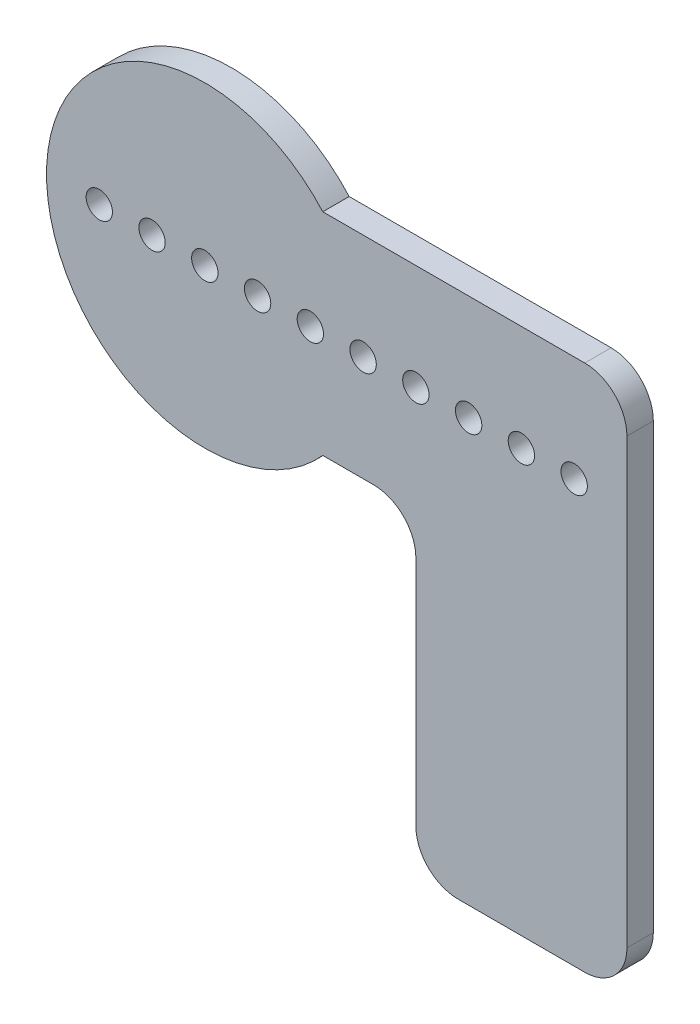
ISO-10303-21;
HEADER;
FILE_DESCRIPTION(('STEP AP214'),'2;1');
FILE_NAME('part.step','',(''),(''),'','','');
FILE_SCHEMA(('AUTOMOTIVE_DESIGN { 1 0 10303 214 1 1 1 1 }'));
ENDSEC;
DATA;
#1=APPLICATION_CONTEXT('core data for automotive mechanical design processes');
#2=APPLICATION_PROTOCOL_DEFINITION('international standard','automotive_design',2000,#1);
#3=PRODUCT_CONTEXT('',#1,'mechanical');
#4=PRODUCT('Part','Part','',(#3));
#5=PRODUCT_RELATED_PRODUCT_CATEGORY('part','',(#4));
#6=PRODUCT_DEFINITION_FORMATION('','',#4);
#7=PRODUCT_DEFINITION_CONTEXT('part definition',#1,'design');
#8=PRODUCT_DEFINITION('design','',#6,#7);
#9=PRODUCT_DEFINITION_SHAPE('','',#8);
#10=(LENGTH_UNIT() NAMED_UNIT(*) SI_UNIT(.MILLI.,.METRE.));
#11=(NAMED_UNIT(*) PLANE_ANGLE_UNIT() SI_UNIT($,.RADIAN.));
#12=(NAMED_UNIT(*) SI_UNIT($,.STERADIAN.) SOLID_ANGLE_UNIT());
#13=UNCERTAINTY_MEASURE_WITH_UNIT(LENGTH_MEASURE(1.E-05),#10,'distance_accuracy_value','');
#14=(GEOMETRIC_REPRESENTATION_CONTEXT(3) GLOBAL_UNCERTAINTY_ASSIGNED_CONTEXT((#13)) GLOBAL_UNIT_ASSIGNED_CONTEXT((#10,
#11,#12)) REPRESENTATION_CONTEXT('',''));
#15=CARTESIAN_POINT('',(0.,0.,0.));
#16=DIRECTION('',(0.,0.,1.));
#17=DIRECTION('',(1.,0.,0.));
#18=AXIS2_PLACEMENT_3D('',#15,#16,#17);
#19=CARTESIAN_POINT('',(-50.8,50.8,3.175));
#20=DIRECTION('',(0.,0.,-1.));
#21=DIRECTION('',(-1.,0.,0.));
#22=AXIS2_PLACEMENT_3D('',#19,#20,#21);
#23=CYLINDRICAL_SURFACE('',#22,19.05);
#24=CARTESIAN_POINT('',(-50.8,50.8,0.));
#25=DIRECTION('',(0.,0.,1.));
#26=DIRECTION('',(1.,0.,0.));
#27=AXIS2_PLACEMENT_3D('',#24,#25,#26);
#28=CIRCLE('',#27,19.05);
#29=CARTESIAN_POINT('',(-36.6009683428763,63.5,0.));
#30=VERTEX_POINT('',#29);
#31=CARTESIAN_POINT('',(-36.6009683428763,38.1,0.));
#32=VERTEX_POINT('',#31);
#33=EDGE_CURVE('E133',#30,#32,#28,.T.);
#34=ORIENTED_EDGE('',*,*,#33,.T.);
#35=DIRECTION('',(0.,0.,-1.));
#36=VECTOR('',#35,1.);
#37=CARTESIAN_POINT('',(-36.6009683428763,38.1,3.175));
#38=LINE('',#37,#36);
#39=CARTESIAN_POINT('',(-36.6009683428763,38.1,3.175));
#40=VERTEX_POINT('',#39);
#41=EDGE_CURVE('E116',#40,#32,#38,.T.);
#42=ORIENTED_EDGE('',*,*,#41,.F.);
#43=CARTESIAN_POINT('',(-50.8,50.8,3.175));
#44=DIRECTION('',(0.,0.,1.));
#45=DIRECTION('',(1.,0.,0.));
#46=AXIS2_PLACEMENT_3D('',#43,#44,#45);
#47=CIRCLE('',#46,19.05);
#48=CARTESIAN_POINT('',(-36.6009683428763,63.5,3.175));
#49=VERTEX_POINT('',#48);
#50=EDGE_CURVE('E121',#49,#40,#47,.T.);
#51=ORIENTED_EDGE('',*,*,#50,.F.);
#52=DIRECTION('',(0.,0.,-1.));
#53=VECTOR('',#52,1.);
#54=CARTESIAN_POINT('',(-36.6009683428763,63.5,3.175));
#55=LINE('',#54,#53);
#56=EDGE_CURVE('E135',#49,#30,#55,.T.);
#57=ORIENTED_EDGE('',*,*,#56,.T.);
#58=EDGE_LOOP('',(#34,#42,#51,#57));
#59=FACE_BOUND('',#58,.T.);
#60=ADVANCED_FACE('F35',(#59),#23,.T.);
#61=CARTESIAN_POINT('',(0.,38.1,3.175));
#62=DIRECTION('',(0.,-1.,0.));
#63=DIRECTION('',(1.,0.,0.));
#64=AXIS2_PLACEMENT_3D('',#61,#62,#63);
#65=PLANE('',#64);
#66=DIRECTION('',(-1.,0.,0.));
#67=VECTOR('',#66,1.);
#68=CARTESIAN_POINT('',(0.,38.1,0.));
#69=LINE('',#68,#67);
#70=CARTESIAN_POINT('',(-30.48,38.1,0.));
#71=VERTEX_POINT('',#70);
#72=EDGE_CURVE('E172',#71,#32,#69,.T.);
#73=ORIENTED_EDGE('',*,*,#72,.F.);
#74=DIRECTION('',(0.,0.,-1.));
#75=VECTOR('',#74,1.);
#76=CARTESIAN_POINT('',(-30.48,38.1,3.175));
#77=LINE('',#76,#75);
#78=CARTESIAN_POINT('',(-30.48,38.1,3.175));
#79=VERTEX_POINT('',#78);
#80=EDGE_CURVE('E119',#71,#79,#77,.F.);
#81=ORIENTED_EDGE('',*,*,#80,.T.);
#82=DIRECTION('',(-1.,0.,0.));
#83=VECTOR('',#82,1.);
#84=CARTESIAN_POINT('',(0.,38.1,3.175));
#85=LINE('',#84,#83);
#86=EDGE_CURVE('E111',#79,#40,#85,.T.);
#87=ORIENTED_EDGE('',*,*,#86,.T.);
#88=ORIENTED_EDGE('',*,*,#41,.T.);
#89=EDGE_LOOP('',(#73,#81,#87,#88));
#90=FACE_BOUND('',#89,.T.);
#91=ADVANCED_FACE('F114',(#90),#65,.T.);
#92=CARTESIAN_POINT('',(-25.4,0.,3.175));
#93=DIRECTION('',(-1.,0.,0.));
#94=DIRECTION('',(0.,0.,1.));
#95=AXIS2_PLACEMENT_3D('',#92,#93,#94);
#96=PLANE('',#95);
#97=DIRECTION('',(0.,1.,0.));
#98=VECTOR('',#97,1.);
#99=CARTESIAN_POINT('',(-25.4,0.,0.));
#100=LINE('',#99,#98);
#101=CARTESIAN_POINT('',(-25.4,5.08,0.));
#102=VERTEX_POINT('',#101);
#103=CARTESIAN_POINT('',(-25.4,33.02,0.));
#104=VERTEX_POINT('',#103);
#105=EDGE_CURVE('E174',#102,#104,#100,.T.);
#106=ORIENTED_EDGE('',*,*,#105,.F.);
#107=DIRECTION('',(0.,0.,-1.));
#108=VECTOR('',#107,1.);
#109=CARTESIAN_POINT('',(-25.4,5.08,3.175));
#110=LINE('',#109,#108);
#111=CARTESIAN_POINT('',(-25.4,5.08,3.175));
#112=VERTEX_POINT('',#111);
#113=EDGE_CURVE('E163',#102,#112,#110,.F.);
#114=ORIENTED_EDGE('',*,*,#113,.T.);
#115=DIRECTION('',(0.,1.,0.));
#116=VECTOR('',#115,1.);
#117=CARTESIAN_POINT('',(-25.4,0.,3.175));
#118=LINE('',#117,#116);
#119=CARTESIAN_POINT('',(-25.4,33.02,3.175));
#120=VERTEX_POINT('',#119);
#121=EDGE_CURVE('E120',#112,#120,#118,.T.);
#122=ORIENTED_EDGE('',*,*,#121,.T.);
#123=DIRECTION('',(0.,0.,-1.));
#124=VECTOR('',#123,1.);
#125=CARTESIAN_POINT('',(-25.4,33.02,0.));
#126=LINE('',#125,#124);
#127=EDGE_CURVE('E160',#120,#104,#126,.T.);
#128=ORIENTED_EDGE('',*,*,#127,.T.);
#129=EDGE_LOOP('',(#106,#114,#122,#128));
#130=FACE_BOUND('',#129,.T.);
#131=ADVANCED_FACE('F180',(#130),#96,.T.);
#132=CARTESIAN_POINT('',(0.,0.,3.175));
#133=DIRECTION('',(0.,-1.,0.));
#134=DIRECTION('',(1.,0.,0.));
#135=AXIS2_PLACEMENT_3D('',#132,#133,#134);
#136=PLANE('',#135);
#137=DIRECTION('',(-1.,0.,0.));
#138=VECTOR('',#137,1.);
#139=CARTESIAN_POINT('',(0.,0.,0.));
#140=LINE('',#139,#138);
#141=CARTESIAN_POINT('',(-5.08,0.,0.));
#142=VERTEX_POINT('',#141);
#143=CARTESIAN_POINT('',(-20.32,0.,0.));
#144=VERTEX_POINT('',#143);
#145=EDGE_CURVE('E194',#142,#144,#140,.T.);
#146=ORIENTED_EDGE('',*,*,#145,.F.);
#147=DIRECTION('',(0.,0.,-1.));
#148=VECTOR('',#147,1.);
#149=CARTESIAN_POINT('',(-5.08,0.,3.175));
#150=LINE('',#149,#148);
#151=CARTESIAN_POINT('',(-5.08,0.,3.175));
#152=VERTEX_POINT('',#151);
#153=EDGE_CURVE('E153',#142,#152,#150,.F.);
#154=ORIENTED_EDGE('',*,*,#153,.T.);
#155=DIRECTION('',(-1.,0.,0.));
#156=VECTOR('',#155,1.);
#157=CARTESIAN_POINT('',(0.,0.,3.175));
#158=LINE('',#157,#156);
#159=CARTESIAN_POINT('',(-20.32,0.,3.175));
#160=VERTEX_POINT('',#159);
#161=EDGE_CURVE('E183',#152,#160,#158,.T.);
#162=ORIENTED_EDGE('',*,*,#161,.T.);
#163=DIRECTION('',(0.,0.,-1.));
#164=VECTOR('',#163,1.);
#165=CARTESIAN_POINT('',(-20.32,0.,3.175));
#166=LINE('',#165,#164);
#167=EDGE_CURVE('E150',#160,#144,#166,.T.);
#168=ORIENTED_EDGE('',*,*,#167,.T.);
#169=EDGE_LOOP('',(#146,#154,#162,#168));
#170=FACE_BOUND('',#169,.T.);
#171=ADVANCED_FACE('F239',(#170),#136,.T.);
#172=CARTESIAN_POINT('',(0.,0.,3.175));
#173=DIRECTION('',(-1.,0.,0.));
#174=DIRECTION('',(0.,0.,1.));
#175=AXIS2_PLACEMENT_3D('',#172,#173,#174);
#176=PLANE('',#175);
#177=DIRECTION('',(0.,1.,0.));
#178=VECTOR('',#177,1.);
#179=CARTESIAN_POINT('',(0.,0.,3.175));
#180=LINE('',#179,#178);
#181=CARTESIAN_POINT('',(0.,5.08,3.175));
#182=VERTEX_POINT('',#181);
#183=CARTESIAN_POINT('',(0.,58.42,3.175));
#184=VERTEX_POINT('',#183);
#185=EDGE_CURVE('E186',#182,#184,#180,.T.);
#186=ORIENTED_EDGE('',*,*,#185,.F.);
#187=DIRECTION('',(0.,0.,-1.));
#188=VECTOR('',#187,1.);
#189=CARTESIAN_POINT('',(0.,5.08,0.));
#190=LINE('',#189,#188);
#191=CARTESIAN_POINT('',(0.,5.08,0.));
#192=VERTEX_POINT('',#191);
#193=EDGE_CURVE('E137',#182,#192,#190,.T.);
#194=ORIENTED_EDGE('',*,*,#193,.T.);
#195=DIRECTION('',(0.,1.,0.));
#196=VECTOR('',#195,1.);
#197=CARTESIAN_POINT('',(0.,0.,0.));
#198=LINE('',#197,#196);
#199=CARTESIAN_POINT('',(0.,58.42,0.));
#200=VERTEX_POINT('',#199);
#201=EDGE_CURVE('E197',#192,#200,#198,.T.);
#202=ORIENTED_EDGE('',*,*,#201,.T.);
#203=DIRECTION('',(0.,0.,-1.));
#204=VECTOR('',#203,1.);
#205=CARTESIAN_POINT('',(0.,58.42,3.175));
#206=LINE('',#205,#204);
#207=EDGE_CURVE('E134',#200,#184,#206,.F.);
#208=ORIENTED_EDGE('',*,*,#207,.T.);
#209=EDGE_LOOP('',(#186,#194,#202,#208));
#210=FACE_BOUND('',#209,.T.);
#211=ADVANCED_FACE('F207',(#210),#176,.F.);
#212=CARTESIAN_POINT('',(0.,63.5,3.175));
#213=DIRECTION('',(0.,-1.,0.));
#214=DIRECTION('',(0.,0.,-1.));
#215=AXIS2_PLACEMENT_3D('',#212,#213,#214);
#216=PLANE('',#215);
#217=DIRECTION('',(-1.,0.,0.));
#218=VECTOR('',#217,1.);
#219=CARTESIAN_POINT('',(0.,63.5,3.175));
#220=LINE('',#219,#218);
#221=CARTESIAN_POINT('',(-5.08,63.5,3.175));
#222=VERTEX_POINT('',#221);
#223=EDGE_CURVE('E126',#222,#49,#220,.T.);
#224=ORIENTED_EDGE('',*,*,#223,.F.);
#225=DIRECTION('',(0.,0.,-1.));
#226=VECTOR('',#225,1.);
#227=CARTESIAN_POINT('',(-5.08,63.5,3.175));
#228=LINE('',#227,#226);
#229=CARTESIAN_POINT('',(-5.08,63.5,0.));
#230=VERTEX_POINT('',#229);
#231=EDGE_CURVE('E166',#222,#230,#228,.T.);
#232=ORIENTED_EDGE('',*,*,#231,.T.);
#233=DIRECTION('',(-1.,0.,0.));
#234=VECTOR('',#233,1.);
#235=CARTESIAN_POINT('',(0.,63.5,0.));
#236=LINE('',#235,#234);
#237=EDGE_CURVE('E130',#230,#30,#236,.T.);
#238=ORIENTED_EDGE('',*,*,#237,.T.);
#239=ORIENTED_EDGE('',*,*,#56,.F.);
#240=EDGE_LOOP('',(#224,#232,#238,#239));
#241=FACE_BOUND('',#240,.T.);
#242=ADVANCED_FACE('F201',(#241),#216,.F.);
#243=CARTESIAN_POINT('',(0.,0.,3.175));
#244=DIRECTION('',(0.,0.,1.));
#245=DIRECTION('',(1.,0.,0.));
#246=AXIS2_PLACEMENT_3D('',#243,#244,#245);
#247=PLANE('',#246);
#248=CARTESIAN_POINT('',(-6.35,50.8,3.175));
#249=DIRECTION('',(0.,0.,1.));
#250=DIRECTION('',(1.,0.,0.));
#251=AXIS2_PLACEMENT_3D('',#248,#249,#250);
#252=CIRCLE('',#251,1.5875);
#253=CARTESIAN_POINT('',(-4.7625,50.8,3.175));
#254=VERTEX_POINT('',#253);
#255=EDGE_CURVE('E298',#254,#254,#252,.T.);
#256=ORIENTED_EDGE('',*,*,#255,.F.);
#257=EDGE_LOOP('',(#256));
#258=FACE_BOUND('',#257,.T.);
#259=CARTESIAN_POINT('',(-57.15,50.7999999999989,3.175));
#260=DIRECTION('',(0.,0.,1.));
#261=DIRECTION('',(1.,0.,0.));
#262=AXIS2_PLACEMENT_3D('',#259,#260,#261);
#263=CIRCLE('',#262,1.58750000000001);
#264=CARTESIAN_POINT('',(-55.5625,50.7999999999989,3.175));
#265=VERTEX_POINT('',#264);
#266=EDGE_CURVE('E310',#265,#265,#263,.T.);
#267=ORIENTED_EDGE('',*,*,#266,.F.);
#268=EDGE_LOOP('',(#267));
#269=FACE_BOUND('',#268,.T.);
#270=CARTESIAN_POINT('',(-12.7,50.7999999999999,3.175));
#271=DIRECTION('',(0.,0.,1.));
#272=DIRECTION('',(1.,0.,0.));
#273=AXIS2_PLACEMENT_3D('',#270,#271,#272);
#274=CIRCLE('',#273,1.5875);
#275=CARTESIAN_POINT('',(-11.1125,50.7999999999999,3.175));
#276=VERTEX_POINT('',#275);
#277=EDGE_CURVE('E303',#276,#276,#274,.T.);
#278=ORIENTED_EDGE('',*,*,#277,.F.);
#279=EDGE_LOOP('',(#278));
#280=FACE_BOUND('',#279,.T.);
#281=CARTESIAN_POINT('',(-19.05,50.7999999999997,3.175));
#282=DIRECTION('',(0.,0.,1.));
#283=DIRECTION('',(1.,0.,0.));
#284=AXIS2_PLACEMENT_3D('',#281,#282,#283);
#285=CIRCLE('',#284,1.5875);
#286=CARTESIAN_POINT('',(-17.4625,50.7999999999997,3.175));
#287=VERTEX_POINT('',#286);
#288=EDGE_CURVE('E342',#287,#287,#285,.T.);
#289=ORIENTED_EDGE('',*,*,#288,.F.);
#290=EDGE_LOOP('',(#289));
#291=FACE_BOUND('',#290,.T.);
#292=CARTESIAN_POINT('',(-25.4,50.7999999999996,3.175));
#293=DIRECTION('',(0.,0.,1.));
#294=DIRECTION('',(1.,0.,0.));
#295=AXIS2_PLACEMENT_3D('',#292,#293,#294);
#296=CIRCLE('',#295,1.58749999999999);
#297=CARTESIAN_POINT('',(-23.8125,50.7999999999996,3.175));
#298=VERTEX_POINT('',#297);
#299=EDGE_CURVE('E348',#298,#298,#296,.T.);
#300=ORIENTED_EDGE('',*,*,#299,.F.);
#301=EDGE_LOOP('',(#300));
#302=FACE_BOUND('',#301,.T.);
#303=CARTESIAN_POINT('',(-63.5,50.7999999999988,3.175));
#304=DIRECTION('',(0.,0.,1.));
#305=DIRECTION('',(1.,0.,0.));
#306=AXIS2_PLACEMENT_3D('',#303,#304,#305);
#307=CIRCLE('',#306,1.5875);
#308=CARTESIAN_POINT('',(-61.9125,50.7999999999988,3.175));
#309=VERTEX_POINT('',#308);
#310=EDGE_CURVE('E316',#309,#309,#307,.T.);
#311=ORIENTED_EDGE('',*,*,#310,.F.);
#312=EDGE_LOOP('',(#311));
#313=FACE_BOUND('',#312,.T.);
#314=CARTESIAN_POINT('',(-31.75,50.7999999999995,3.175));
#315=DIRECTION('',(0.,0.,1.));
#316=DIRECTION('',(1.,0.,0.));
#317=AXIS2_PLACEMENT_3D('',#314,#315,#316);
#318=CIRCLE('',#317,1.5875);
#319=CARTESIAN_POINT('',(-30.1625,50.7999999999995,3.175));
#320=VERTEX_POINT('',#319);
#321=EDGE_CURVE('E317',#320,#320,#318,.T.);
#322=ORIENTED_EDGE('',*,*,#321,.F.);
#323=EDGE_LOOP('',(#322));
#324=FACE_BOUND('',#323,.T.);
#325=CARTESIAN_POINT('',(-38.1,50.7999999999993,3.175));
#326=DIRECTION('',(0.,0.,1.));
#327=DIRECTION('',(1.,0.,0.));
#328=AXIS2_PLACEMENT_3D('',#325,#326,#327);
#329=CIRCLE('',#328,1.58750000000001);
#330=CARTESIAN_POINT('',(-36.5125,50.7999999999993,3.175));
#331=VERTEX_POINT('',#330);
#332=EDGE_CURVE('E323',#331,#331,#329,.T.);
#333=ORIENTED_EDGE('',*,*,#332,.F.);
#334=EDGE_LOOP('',(#333));
#335=FACE_BOUND('',#334,.T.);
#336=CARTESIAN_POINT('',(-44.45,50.7999999999992,3.175));
#337=DIRECTION('',(0.,0.,1.));
#338=DIRECTION('',(1.,0.,0.));
#339=AXIS2_PLACEMENT_3D('',#336,#337,#338);
#340=CIRCLE('',#339,1.58750000000001);
#341=CARTESIAN_POINT('',(-42.8625,50.7999999999992,3.175));
#342=VERTEX_POINT('',#341);
#343=EDGE_CURVE('E329',#342,#342,#340,.T.);
#344=ORIENTED_EDGE('',*,*,#343,.F.);
#345=EDGE_LOOP('',(#344));
#346=FACE_BOUND('',#345,.T.);
#347=CARTESIAN_POINT('',(-50.8,50.7999999999991,3.175));
#348=DIRECTION('',(0.,0.,1.));
#349=DIRECTION('',(1.,0.,0.));
#350=AXIS2_PLACEMENT_3D('',#347,#348,#349);
#351=CIRCLE('',#350,1.5875);
#352=CARTESIAN_POINT('',(-49.2125,50.7999999999991,3.175));
#353=VERTEX_POINT('',#352);
#354=EDGE_CURVE('E309',#353,#353,#351,.T.);
#355=ORIENTED_EDGE('',*,*,#354,.F.);
#356=EDGE_LOOP('',(#355));
#357=FACE_BOUND('',#356,.T.);
#358=ORIENTED_EDGE('',*,*,#161,.F.);
#359=CARTESIAN_POINT('',(-5.08,5.08,3.175));
#360=DIRECTION('',(0.,0.,1.));
#361=DIRECTION('',(1.,0.,0.));
#362=AXIS2_PLACEMENT_3D('',#359,#360,#361);
#363=CIRCLE('',#362,5.08);
#364=EDGE_CURVE('E158',#152,#182,#363,.T.);
#365=ORIENTED_EDGE('',*,*,#364,.T.);
#366=ORIENTED_EDGE('',*,*,#185,.T.);
#367=CARTESIAN_POINT('',(-5.08,58.42,3.175));
#368=DIRECTION('',(0.,0.,1.));
#369=DIRECTION('',(1.,0.,0.));
#370=AXIS2_PLACEMENT_3D('',#367,#368,#369);
#371=CIRCLE('',#370,5.08);
#372=EDGE_CURVE('E50',#184,#222,#371,.T.);
#373=ORIENTED_EDGE('',*,*,#372,.T.);
#374=ORIENTED_EDGE('',*,*,#223,.T.);
#375=ORIENTED_EDGE('',*,*,#50,.T.);
#376=ORIENTED_EDGE('',*,*,#86,.F.);
#377=CARTESIAN_POINT('',(-30.48,33.02,3.175));
#378=DIRECTION('',(0.,0.,1.));
#379=DIRECTION('',(1.,0.,0.));
#380=AXIS2_PLACEMENT_3D('',#377,#378,#379);
#381=CIRCLE('',#380,5.08);
#382=EDGE_CURVE('E11',#79,#120,#381,.F.);
#383=ORIENTED_EDGE('',*,*,#382,.T.);
#384=ORIENTED_EDGE('',*,*,#121,.F.);
#385=CARTESIAN_POINT('',(-20.32,5.08,3.175));
#386=DIRECTION('',(0.,0.,1.));
#387=DIRECTION('',(1.,0.,0.));
#388=AXIS2_PLACEMENT_3D('',#385,#386,#387);
#389=CIRCLE('',#388,5.08);
#390=EDGE_CURVE('E156',#112,#160,#389,.T.);
#391=ORIENTED_EDGE('',*,*,#390,.T.);
#392=EDGE_LOOP('',(#358,#365,#366,#373,#374,#375,#376,#383,#384,#391));
#393=FACE_BOUND('',#392,.T.);
#394=ADVANCED_FACE('F125',(#258,#269,#280,#291,#302,#313,#324,#335,#346,#357,#393),#247,.T.);
#395=CARTESIAN_POINT('',(0.,0.,0.));
#396=DIRECTION('',(0.,0.,1.));
#397=DIRECTION('',(1.,0.,0.));
#398=AXIS2_PLACEMENT_3D('',#395,#396,#397);
#399=PLANE('',#398);
#400=CARTESIAN_POINT('',(-6.35,50.8,0.));
#401=DIRECTION('',(0.,0.,1.));
#402=DIRECTION('',(1.,0.,0.));
#403=AXIS2_PLACEMENT_3D('',#400,#401,#402);
#404=CIRCLE('',#403,1.5875);
#405=CARTESIAN_POINT('',(-4.7625,50.8,0.));
#406=VERTEX_POINT('',#405);
#407=EDGE_CURVE('E191',#406,#406,#404,.T.);
#408=ORIENTED_EDGE('',*,*,#407,.T.);
#409=EDGE_LOOP('',(#408));
#410=FACE_BOUND('',#409,.T.);
#411=CARTESIAN_POINT('',(-57.15,50.7999999999989,0.));
#412=DIRECTION('',(0.,0.,1.));
#413=DIRECTION('',(1.,0.,0.));
#414=AXIS2_PLACEMENT_3D('',#411,#412,#413);
#415=CIRCLE('',#414,1.58750000000001);
#416=CARTESIAN_POINT('',(-55.5625,50.7999999999989,0.));
#417=VERTEX_POINT('',#416);
#418=EDGE_CURVE('E306',#417,#417,#415,.T.);
#419=ORIENTED_EDGE('',*,*,#418,.T.);
#420=EDGE_LOOP('',(#419));
#421=FACE_BOUND('',#420,.T.);
#422=CARTESIAN_POINT('',(-12.7,50.7999999999999,0.));
#423=DIRECTION('',(0.,0.,1.));
#424=DIRECTION('',(1.,0.,0.));
#425=AXIS2_PLACEMENT_3D('',#422,#423,#424);
#426=CIRCLE('',#425,1.5875);
#427=CARTESIAN_POINT('',(-11.1125,50.7999999999999,0.));
#428=VERTEX_POINT('',#427);
#429=EDGE_CURVE('E299',#428,#428,#426,.T.);
#430=ORIENTED_EDGE('',*,*,#429,.T.);
#431=EDGE_LOOP('',(#430));
#432=FACE_BOUND('',#431,.T.);
#433=CARTESIAN_POINT('',(-19.05,50.7999999999997,0.));
#434=DIRECTION('',(0.,0.,1.));
#435=DIRECTION('',(1.,0.,0.));
#436=AXIS2_PLACEMENT_3D('',#433,#434,#435);
#437=CIRCLE('',#436,1.5875);
#438=CARTESIAN_POINT('',(-17.4625,50.7999999999997,0.));
#439=VERTEX_POINT('',#438);
#440=EDGE_CURVE('E339',#439,#439,#437,.T.);
#441=ORIENTED_EDGE('',*,*,#440,.T.);
#442=EDGE_LOOP('',(#441));
#443=FACE_BOUND('',#442,.T.);
#444=CARTESIAN_POINT('',(-25.4,50.7999999999996,0.));
#445=DIRECTION('',(0.,0.,1.));
#446=DIRECTION('',(1.,0.,0.));
#447=AXIS2_PLACEMENT_3D('',#444,#445,#446);
#448=CIRCLE('',#447,1.58749999999999);
#449=CARTESIAN_POINT('',(-23.8125,50.7999999999996,0.));
#450=VERTEX_POINT('',#449);
#451=EDGE_CURVE('E345',#450,#450,#448,.T.);
#452=ORIENTED_EDGE('',*,*,#451,.T.);
#453=EDGE_LOOP('',(#452));
#454=FACE_BOUND('',#453,.T.);
#455=CARTESIAN_POINT('',(-63.5,50.7999999999988,0.));
#456=DIRECTION('',(0.,0.,1.));
#457=DIRECTION('',(1.,0.,0.));
#458=AXIS2_PLACEMENT_3D('',#455,#456,#457);
#459=CIRCLE('',#458,1.5875);
#460=CARTESIAN_POINT('',(-61.9125,50.7999999999988,0.));
#461=VERTEX_POINT('',#460);
#462=EDGE_CURVE('E351',#461,#461,#459,.T.);
#463=ORIENTED_EDGE('',*,*,#462,.T.);
#464=EDGE_LOOP('',(#463));
#465=FACE_BOUND('',#464,.T.);
#466=CARTESIAN_POINT('',(-31.75,50.7999999999995,0.));
#467=DIRECTION('',(0.,0.,1.));
#468=DIRECTION('',(1.,0.,0.));
#469=AXIS2_PLACEMENT_3D('',#466,#467,#468);
#470=CIRCLE('',#469,1.5875);
#471=CARTESIAN_POINT('',(-30.1625,50.7999999999995,0.));
#472=VERTEX_POINT('',#471);
#473=EDGE_CURVE('E313',#472,#472,#470,.T.);
#474=ORIENTED_EDGE('',*,*,#473,.T.);
#475=EDGE_LOOP('',(#474));
#476=FACE_BOUND('',#475,.T.);
#477=CARTESIAN_POINT('',(-38.1,50.7999999999993,0.));
#478=DIRECTION('',(0.,0.,1.));
#479=DIRECTION('',(1.,0.,0.));
#480=AXIS2_PLACEMENT_3D('',#477,#478,#479);
#481=CIRCLE('',#480,1.58750000000001);
#482=CARTESIAN_POINT('',(-36.5125,50.7999999999993,0.));
#483=VERTEX_POINT('',#482);
#484=EDGE_CURVE('E320',#483,#483,#481,.T.);
#485=ORIENTED_EDGE('',*,*,#484,.T.);
#486=EDGE_LOOP('',(#485));
#487=FACE_BOUND('',#486,.T.);
#488=CARTESIAN_POINT('',(-44.45,50.7999999999992,0.));
#489=DIRECTION('',(0.,0.,1.));
#490=DIRECTION('',(1.,0.,0.));
#491=AXIS2_PLACEMENT_3D('',#488,#489,#490);
#492=CIRCLE('',#491,1.58750000000001);
#493=CARTESIAN_POINT('',(-42.8625,50.7999999999992,0.));
#494=VERTEX_POINT('',#493);
#495=EDGE_CURVE('E326',#494,#494,#492,.T.);
#496=ORIENTED_EDGE('',*,*,#495,.T.);
#497=EDGE_LOOP('',(#496));
#498=FACE_BOUND('',#497,.T.);
#499=CARTESIAN_POINT('',(-50.8,50.7999999999991,0.));
#500=DIRECTION('',(0.,0.,1.));
#501=DIRECTION('',(1.,0.,0.));
#502=AXIS2_PLACEMENT_3D('',#499,#500,#501);
#503=CIRCLE('',#502,1.5875);
#504=CARTESIAN_POINT('',(-49.2125,50.7999999999991,0.));
#505=VERTEX_POINT('',#504);
#506=EDGE_CURVE('E332',#505,#505,#503,.T.);
#507=ORIENTED_EDGE('',*,*,#506,.T.);
#508=EDGE_LOOP('',(#507));
#509=FACE_BOUND('',#508,.T.);
#510=ORIENTED_EDGE('',*,*,#201,.F.);
#511=CARTESIAN_POINT('',(-5.08,5.08,0.));
#512=DIRECTION('',(0.,0.,1.));
#513=DIRECTION('',(1.,0.,0.));
#514=AXIS2_PLACEMENT_3D('',#511,#512,#513);
#515=CIRCLE('',#514,5.08);
#516=EDGE_CURVE('E148',#192,#142,#515,.F.);
#517=ORIENTED_EDGE('',*,*,#516,.T.);
#518=ORIENTED_EDGE('',*,*,#145,.T.);
#519=CARTESIAN_POINT('',(-20.32,5.08,0.));
#520=DIRECTION('',(0.,0.,1.));
#521=DIRECTION('',(1.,0.,0.));
#522=AXIS2_PLACEMENT_3D('',#519,#520,#521);
#523=CIRCLE('',#522,5.08);
#524=EDGE_CURVE('E146',#144,#102,#523,.F.);
#525=ORIENTED_EDGE('',*,*,#524,.T.);
#526=ORIENTED_EDGE('',*,*,#105,.T.);
#527=CARTESIAN_POINT('',(-30.48,33.02,0.));
#528=DIRECTION('',(0.,0.,1.));
#529=DIRECTION('',(1.,0.,0.));
#530=AXIS2_PLACEMENT_3D('',#527,#528,#529);
#531=CIRCLE('',#530,5.08);
#532=EDGE_CURVE('E43',#104,#71,#531,.T.);
#533=ORIENTED_EDGE('',*,*,#532,.T.);
#534=ORIENTED_EDGE('',*,*,#72,.T.);
#535=ORIENTED_EDGE('',*,*,#33,.F.);
#536=ORIENTED_EDGE('',*,*,#237,.F.);
#537=CARTESIAN_POINT('',(-5.08,58.42,0.));
#538=DIRECTION('',(0.,0.,1.));
#539=DIRECTION('',(1.,0.,0.));
#540=AXIS2_PLACEMENT_3D('',#537,#538,#539);
#541=CIRCLE('',#540,5.08);
#542=EDGE_CURVE('E144',#230,#200,#541,.F.);
#543=ORIENTED_EDGE('',*,*,#542,.T.);
#544=EDGE_LOOP('',(#510,#517,#518,#525,#526,#533,#534,#535,#536,#543));
#545=FACE_BOUND('',#544,.T.);
#546=ADVANCED_FACE('F171',(#410,#421,#432,#443,#454,#465,#476,#487,#498,#509,#545),#399,.F.);
#547=CARTESIAN_POINT('',(-5.08,5.08,3.175));
#548=DIRECTION('',(0.,0.,1.));
#549=DIRECTION('',(1.,0.,0.));
#550=AXIS2_PLACEMENT_3D('',#547,#548,#549);
#551=CYLINDRICAL_SURFACE('',#550,5.08);
#552=ORIENTED_EDGE('',*,*,#364,.F.);
#553=ORIENTED_EDGE('',*,*,#153,.F.);
#554=ORIENTED_EDGE('',*,*,#516,.F.);
#555=ORIENTED_EDGE('',*,*,#193,.F.);
#556=EDGE_LOOP('',(#552,#553,#554,#555));
#557=FACE_BOUND('',#556,.T.);
#558=ADVANCED_FACE('F227',(#557),#551,.T.);
#559=CARTESIAN_POINT('',(-20.32,5.08,3.175));
#560=DIRECTION('',(0.,0.,-1.));
#561=DIRECTION('',(-1.,0.,0.));
#562=AXIS2_PLACEMENT_3D('',#559,#560,#561);
#563=CYLINDRICAL_SURFACE('',#562,5.08);
#564=ORIENTED_EDGE('',*,*,#390,.F.);
#565=ORIENTED_EDGE('',*,*,#113,.F.);
#566=ORIENTED_EDGE('',*,*,#524,.F.);
#567=ORIENTED_EDGE('',*,*,#167,.F.);
#568=EDGE_LOOP('',(#564,#565,#566,#567));
#569=FACE_BOUND('',#568,.T.);
#570=ADVANCED_FACE('F218',(#569),#563,.T.);
#571=CARTESIAN_POINT('',(-30.48,33.02,3.175));
#572=DIRECTION('',(0.,0.,1.));
#573=DIRECTION('',(1.,0.,0.));
#574=AXIS2_PLACEMENT_3D('',#571,#572,#573);
#575=CYLINDRICAL_SURFACE('',#574,5.08);
#576=ORIENTED_EDGE('',*,*,#382,.F.);
#577=ORIENTED_EDGE('',*,*,#80,.F.);
#578=ORIENTED_EDGE('',*,*,#532,.F.);
#579=ORIENTED_EDGE('',*,*,#127,.F.);
#580=EDGE_LOOP('',(#576,#577,#578,#579));
#581=FACE_BOUND('',#580,.T.);
#582=ADVANCED_FACE('F178',(#581),#575,.F.);
#583=CARTESIAN_POINT('',(-5.08,58.42,3.175));
#584=DIRECTION('',(0.,0.,-1.));
#585=DIRECTION('',(-1.,0.,0.));
#586=AXIS2_PLACEMENT_3D('',#583,#584,#585);
#587=CYLINDRICAL_SURFACE('',#586,5.08);
#588=ORIENTED_EDGE('',*,*,#372,.F.);
#589=ORIENTED_EDGE('',*,*,#207,.F.);
#590=ORIENTED_EDGE('',*,*,#542,.F.);
#591=ORIENTED_EDGE('',*,*,#231,.F.);
#592=EDGE_LOOP('',(#588,#589,#590,#591));
#593=FACE_BOUND('',#592,.T.);
#594=ADVANCED_FACE('F37',(#593),#587,.T.);
#595=CARTESIAN_POINT('',(-50.8,50.7999999999991,0.));
#596=DIRECTION('',(0.,0.,1.));
#597=DIRECTION('',(1.,0.,0.));
#598=AXIS2_PLACEMENT_3D('',#595,#596,#597);
#599=CYLINDRICAL_SURFACE('',#598,1.5875);
#600=ORIENTED_EDGE('',*,*,#506,.F.);
#601=EDGE_LOOP('',(#600));
#602=FACE_BOUND('',#601,.T.);
#603=ORIENTED_EDGE('',*,*,#354,.T.);
#604=EDGE_LOOP('',(#603));
#605=FACE_BOUND('',#604,.T.);
#606=ADVANCED_FACE('F210',(#602,#605),#599,.F.);
#607=CARTESIAN_POINT('',(-44.45,50.7999999999992,0.));
#608=DIRECTION('',(0.,0.,1.));
#609=DIRECTION('',(1.,0.,0.));
#610=AXIS2_PLACEMENT_3D('',#607,#608,#609);
#611=CYLINDRICAL_SURFACE('',#610,1.58750000000001);
#612=ORIENTED_EDGE('',*,*,#495,.F.);
#613=EDGE_LOOP('',(#612));
#614=FACE_BOUND('',#613,.T.);
#615=ORIENTED_EDGE('',*,*,#343,.T.);
#616=EDGE_LOOP('',(#615));
#617=FACE_BOUND('',#616,.T.);
#618=ADVANCED_FACE('F215',(#614,#617),#611,.F.);
#619=CARTESIAN_POINT('',(-38.1,50.7999999999993,0.));
#620=DIRECTION('',(0.,0.,1.));
#621=DIRECTION('',(1.,0.,0.));
#622=AXIS2_PLACEMENT_3D('',#619,#620,#621);
#623=CYLINDRICAL_SURFACE('',#622,1.58750000000001);
#624=ORIENTED_EDGE('',*,*,#484,.F.);
#625=EDGE_LOOP('',(#624));
#626=FACE_BOUND('',#625,.T.);
#627=ORIENTED_EDGE('',*,*,#332,.T.);
#628=EDGE_LOOP('',(#627));
#629=FACE_BOUND('',#628,.T.);
#630=ADVANCED_FACE('F277',(#626,#629),#623,.F.);
#631=CARTESIAN_POINT('',(-31.75,50.7999999999995,0.));
#632=DIRECTION('',(0.,0.,1.));
#633=DIRECTION('',(1.,0.,0.));
#634=AXIS2_PLACEMENT_3D('',#631,#632,#633);
#635=CYLINDRICAL_SURFACE('',#634,1.5875);
#636=ORIENTED_EDGE('',*,*,#473,.F.);
#637=EDGE_LOOP('',(#636));
#638=FACE_BOUND('',#637,.T.);
#639=ORIENTED_EDGE('',*,*,#321,.T.);
#640=EDGE_LOOP('',(#639));
#641=FACE_BOUND('',#640,.T.);
#642=ADVANCED_FACE('F261',(#638,#641),#635,.F.);
#643=CARTESIAN_POINT('',(-63.5,50.7999999999988,0.));
#644=DIRECTION('',(0.,0.,1.));
#645=DIRECTION('',(1.,0.,0.));
#646=AXIS2_PLACEMENT_3D('',#643,#644,#645);
#647=CYLINDRICAL_SURFACE('',#646,1.5875);
#648=ORIENTED_EDGE('',*,*,#462,.F.);
#649=EDGE_LOOP('',(#648));
#650=FACE_BOUND('',#649,.T.);
#651=ORIENTED_EDGE('',*,*,#310,.T.);
#652=EDGE_LOOP('',(#651));
#653=FACE_BOUND('',#652,.T.);
#654=ADVANCED_FACE('F257',(#650,#653),#647,.F.);
#655=CARTESIAN_POINT('',(-25.4,50.7999999999996,0.));
#656=DIRECTION('',(0.,0.,1.));
#657=DIRECTION('',(1.,0.,0.));
#658=AXIS2_PLACEMENT_3D('',#655,#656,#657);
#659=CYLINDRICAL_SURFACE('',#658,1.58749999999999);
#660=ORIENTED_EDGE('',*,*,#451,.F.);
#661=EDGE_LOOP('',(#660));
#662=FACE_BOUND('',#661,.T.);
#663=ORIENTED_EDGE('',*,*,#299,.T.);
#664=EDGE_LOOP('',(#663));
#665=FACE_BOUND('',#664,.T.);
#666=ADVANCED_FACE('F260',(#662,#665),#659,.F.);
#667=CARTESIAN_POINT('',(-19.05,50.7999999999997,0.));
#668=DIRECTION('',(0.,0.,1.));
#669=DIRECTION('',(1.,0.,0.));
#670=AXIS2_PLACEMENT_3D('',#667,#668,#669);
#671=CYLINDRICAL_SURFACE('',#670,1.5875);
#672=ORIENTED_EDGE('',*,*,#440,.F.);
#673=EDGE_LOOP('',(#672));
#674=FACE_BOUND('',#673,.T.);
#675=ORIENTED_EDGE('',*,*,#288,.T.);
#676=EDGE_LOOP('',(#675));
#677=FACE_BOUND('',#676,.T.);
#678=ADVANCED_FACE('F265',(#674,#677),#671,.F.);
#679=CARTESIAN_POINT('',(-12.7,50.7999999999999,0.));
#680=DIRECTION('',(0.,0.,1.));
#681=DIRECTION('',(1.,0.,0.));
#682=AXIS2_PLACEMENT_3D('',#679,#680,#681);
#683=CYLINDRICAL_SURFACE('',#682,1.5875);
#684=ORIENTED_EDGE('',*,*,#429,.F.);
#685=EDGE_LOOP('',(#684));
#686=FACE_BOUND('',#685,.T.);
#687=ORIENTED_EDGE('',*,*,#277,.T.);
#688=EDGE_LOOP('',(#687));
#689=FACE_BOUND('',#688,.T.);
#690=ADVANCED_FACE('F269',(#686,#689),#683,.F.);
#691=CARTESIAN_POINT('',(-57.15,50.7999999999989,0.));
#692=DIRECTION('',(0.,0.,1.));
#693=DIRECTION('',(1.,0.,0.));
#694=AXIS2_PLACEMENT_3D('',#691,#692,#693);
#695=CYLINDRICAL_SURFACE('',#694,1.58750000000001);
#696=ORIENTED_EDGE('',*,*,#418,.F.);
#697=EDGE_LOOP('',(#696));
#698=FACE_BOUND('',#697,.T.);
#699=ORIENTED_EDGE('',*,*,#266,.T.);
#700=EDGE_LOOP('',(#699));
#701=FACE_BOUND('',#700,.T.);
#702=ADVANCED_FACE('F272',(#698,#701),#695,.F.);
#703=CARTESIAN_POINT('',(-6.35,50.8,0.));
#704=DIRECTION('',(0.,0.,1.));
#705=DIRECTION('',(1.,0.,0.));
#706=AXIS2_PLACEMENT_3D('',#703,#704,#705);
#707=CYLINDRICAL_SURFACE('',#706,1.5875);
#708=ORIENTED_EDGE('',*,*,#407,.F.);
#709=EDGE_LOOP('',(#708));
#710=FACE_BOUND('',#709,.T.);
#711=ORIENTED_EDGE('',*,*,#255,.T.);
#712=EDGE_LOOP('',(#711));
#713=FACE_BOUND('',#712,.T.);
#714=ADVANCED_FACE('F287',(#710,#713),#707,.F.);
#715=CLOSED_SHELL('',(#60,#91,#131,#171,#211,#242,#394,#546,#558,#570,#582,#594,#606,#618,#630,
#642,#654,#666,#678,#690,#702,#714));
#716=MANIFOLD_SOLID_BREP('B2',#715);
#717=ADVANCED_BREP_SHAPE_REPRESENTATION('',(#18,#716),#14);
#718=SHAPE_DEFINITION_REPRESENTATION(#9,#717);
ENDSEC;
END-ISO-10303-21;
